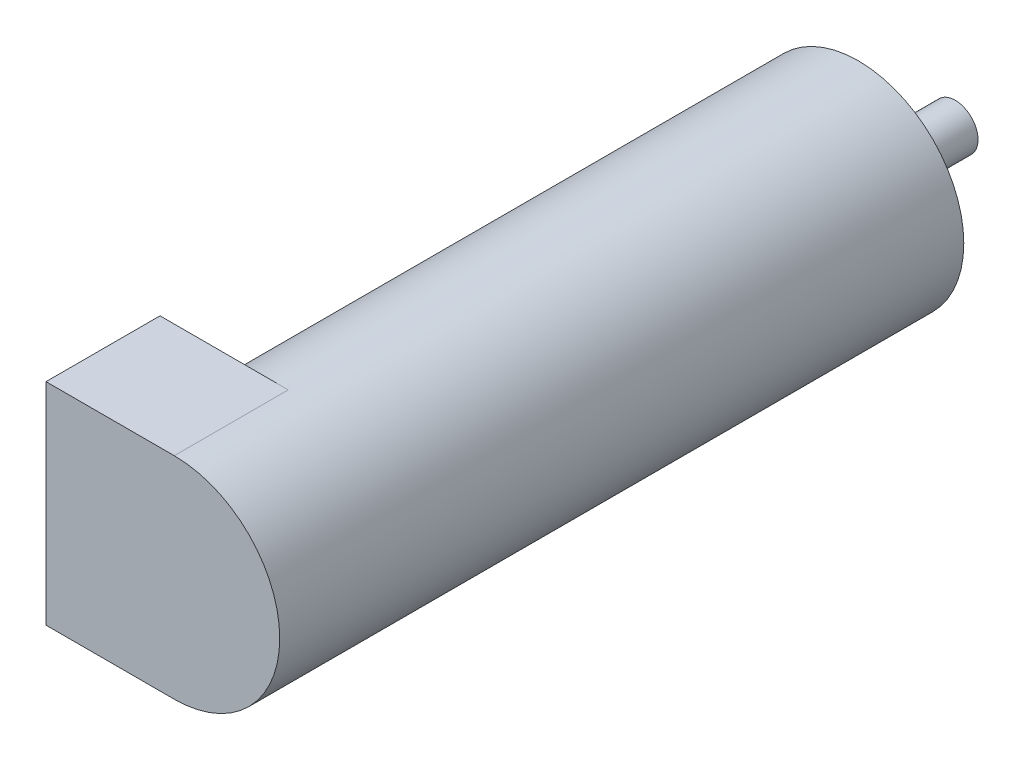
ISO-10303-21;
HEADER;
FILE_DESCRIPTION(('STEP AP214'),'2;1');
FILE_NAME('part.step','',(''),(''),'','','');
FILE_SCHEMA(('AUTOMOTIVE_DESIGN { 1 0 10303 214 1 1 1 1 }'));
ENDSEC;
DATA;
#1=APPLICATION_CONTEXT('core data for automotive mechanical design processes');
#2=APPLICATION_PROTOCOL_DEFINITION('international standard','automotive_design',2000,#1);
#3=PRODUCT_CONTEXT('',#1,'mechanical');
#4=PRODUCT('Part','Part','',(#3));
#5=PRODUCT_RELATED_PRODUCT_CATEGORY('part','',(#4));
#6=PRODUCT_DEFINITION_FORMATION('','',#4);
#7=PRODUCT_DEFINITION_CONTEXT('part definition',#1,'design');
#8=PRODUCT_DEFINITION('design','',#6,#7);
#9=PRODUCT_DEFINITION_SHAPE('','',#8);
#10=(LENGTH_UNIT() NAMED_UNIT(*) SI_UNIT(.MILLI.,.METRE.));
#11=(NAMED_UNIT(*) PLANE_ANGLE_UNIT() SI_UNIT($,.RADIAN.));
#12=(NAMED_UNIT(*) SI_UNIT($,.STERADIAN.) SOLID_ANGLE_UNIT());
#13=UNCERTAINTY_MEASURE_WITH_UNIT(LENGTH_MEASURE(1.E-05),#10,'distance_accuracy_value','');
#14=(GEOMETRIC_REPRESENTATION_CONTEXT(3) GLOBAL_UNCERTAINTY_ASSIGNED_CONTEXT((#13)) GLOBAL_UNIT_ASSIGNED_CONTEXT((#10,
#11,#12)) REPRESENTATION_CONTEXT('',''));
#15=CARTESIAN_POINT('',(0.,0.,0.));
#16=DIRECTION('',(0.,0.,1.));
#17=DIRECTION('',(1.,0.,0.));
#18=AXIS2_PLACEMENT_3D('',#15,#16,#17);
#19=CARTESIAN_POINT('',(0.,0.,100.));
#20=DIRECTION('',(0.,0.,-1.));
#21=DIRECTION('',(-1.,0.,0.));
#22=AXIS2_PLACEMENT_3D('',#19,#20,#21);
#23=CYLINDRICAL_SURFACE('',#22,18.5);
#24=CARTESIAN_POINT('',(0.,0.,100.));
#25=DIRECTION('',(0.,0.,1.));
#26=DIRECTION('',(1.,0.,0.));
#27=AXIS2_PLACEMENT_3D('',#24,#25,#26);
#28=CIRCLE('',#27,18.5);
#29=CARTESIAN_POINT('',(0.,18.5,100.));
#30=VERTEX_POINT('',#29);
#31=CARTESIAN_POINT('',(0.,-18.5,100.));
#32=VERTEX_POINT('',#31);
#33=EDGE_CURVE('E48',#30,#32,#28,.T.);
#34=ORIENTED_EDGE('',*,*,#33,.F.);
#35=DIRECTION('',(0.,0.,-1.));
#36=VECTOR('',#35,1.);
#37=CARTESIAN_POINT('',(0.,18.5,120.));
#38=LINE('',#37,#36);
#39=CARTESIAN_POINT('',(0.,18.5,120.));
#40=VERTEX_POINT('',#39);
#41=EDGE_CURVE('E102',#40,#30,#38,.T.);
#42=ORIENTED_EDGE('',*,*,#41,.F.);
#43=CARTESIAN_POINT('',(0.,0.,120.));
#44=DIRECTION('',(0.,0.,1.));
#45=DIRECTION('',(1.,0.,0.));
#46=AXIS2_PLACEMENT_3D('',#43,#44,#45);
#47=CIRCLE('',#46,18.5);
#48=CARTESIAN_POINT('',(0.,-18.5,120.));
#49=VERTEX_POINT('',#48);
#50=EDGE_CURVE('E94',#49,#40,#47,.T.);
#51=ORIENTED_EDGE('',*,*,#50,.F.);
#52=DIRECTION('',(0.,0.,-1.));
#53=VECTOR('',#52,1.);
#54=CARTESIAN_POINT('',(0.,-18.5,120.));
#55=LINE('',#54,#53);
#56=EDGE_CURVE('E109',#49,#32,#55,.T.);
#57=ORIENTED_EDGE('',*,*,#56,.T.);
#58=EDGE_LOOP('',(#34,#42,#51,#57));
#59=FACE_BOUND('',#58,.T.);
#60=CARTESIAN_POINT('',(0.,0.,0.));
#61=DIRECTION('',(0.,0.,1.));
#62=DIRECTION('',(1.,0.,0.));
#63=AXIS2_PLACEMENT_3D('',#60,#61,#62);
#64=CIRCLE('',#63,18.5);
#65=CARTESIAN_POINT('',(18.5,0.,0.));
#66=VERTEX_POINT('',#65);
#67=EDGE_CURVE('E42',#66,#66,#64,.T.);
#68=ORIENTED_EDGE('',*,*,#67,.T.);
#69=EDGE_LOOP('',(#68));
#70=FACE_BOUND('',#69,.T.);
#71=ADVANCED_FACE('F39',(#59,#70),#23,.T.);
#72=CARTESIAN_POINT('',(0.,0.,0.));
#73=DIRECTION('',(0.,0.,1.));
#74=DIRECTION('',(1.,0.,0.));
#75=AXIS2_PLACEMENT_3D('',#72,#73,#74);
#76=PLANE('',#75);
#77=CARTESIAN_POINT('',(-15.,0.,0.));
#78=DIRECTION('',(0.,0.,-1.));
#79=DIRECTION('',(-1.,0.,0.));
#80=AXIS2_PLACEMENT_3D('',#77,#78,#79);
#81=CIRCLE('',#80,1.5);
#82=CARTESIAN_POINT('',(-16.5,0.,0.));
#83=VERTEX_POINT('',#82);
#84=EDGE_CURVE('E201',#83,#83,#81,.T.);
#85=ORIENTED_EDGE('',*,*,#84,.F.);
#86=EDGE_LOOP('',(#85));
#87=FACE_BOUND('',#86,.T.);
#88=CARTESIAN_POINT('',(0.,15.,0.));
#89=DIRECTION('',(0.,0.,-1.));
#90=DIRECTION('',(-1.,0.,0.));
#91=AXIS2_PLACEMENT_3D('',#88,#89,#90);
#92=CIRCLE('',#91,1.5);
#93=CARTESIAN_POINT('',(-1.5,15.,0.));
#94=VERTEX_POINT('',#93);
#95=EDGE_CURVE('E214',#94,#94,#92,.T.);
#96=ORIENTED_EDGE('',*,*,#95,.F.);
#97=EDGE_LOOP('',(#96));
#98=FACE_BOUND('',#97,.T.);
#99=CARTESIAN_POINT('',(15.,0.,0.));
#100=DIRECTION('',(0.,0.,-1.));
#101=DIRECTION('',(-1.,0.,0.));
#102=AXIS2_PLACEMENT_3D('',#99,#100,#101);
#103=CIRCLE('',#102,1.5);
#104=CARTESIAN_POINT('',(13.5,0.,0.));
#105=VERTEX_POINT('',#104);
#106=EDGE_CURVE('E222',#105,#105,#103,.T.);
#107=ORIENTED_EDGE('',*,*,#106,.F.);
#108=EDGE_LOOP('',(#107));
#109=FACE_BOUND('',#108,.T.);
#110=CARTESIAN_POINT('',(0.,-15.,0.));
#111=DIRECTION('',(0.,0.,-1.));
#112=DIRECTION('',(-1.,0.,0.));
#113=AXIS2_PLACEMENT_3D('',#110,#111,#112);
#114=CIRCLE('',#113,1.5);
#115=CARTESIAN_POINT('',(-1.5,-15.,0.));
#116=VERTEX_POINT('',#115);
#117=EDGE_CURVE('E230',#116,#116,#114,.T.);
#118=ORIENTED_EDGE('',*,*,#117,.F.);
#119=EDGE_LOOP('',(#118));
#120=FACE_BOUND('',#119,.T.);
#121=CARTESIAN_POINT('',(0.,0.,0.));
#122=DIRECTION('',(0.,0.,-1.));
#123=DIRECTION('',(-1.,0.,0.));
#124=AXIS2_PLACEMENT_3D('',#121,#122,#123);
#125=CIRCLE('',#124,4.);
#126=CARTESIAN_POINT('',(-4.,0.,0.));
#127=VERTEX_POINT('',#126);
#128=EDGE_CURVE('E11',#127,#127,#125,.T.);
#129=ORIENTED_EDGE('',*,*,#128,.F.);
#130=EDGE_LOOP('',(#129));
#131=FACE_BOUND('',#130,.T.);
#132=ORIENTED_EDGE('',*,*,#67,.F.);
#133=EDGE_LOOP('',(#132));
#134=FACE_BOUND('',#133,.T.);
#135=ADVANCED_FACE('F133',(#87,#98,#109,#120,#131,#134),#76,.F.);
#136=CARTESIAN_POINT('',(0.,0.,100.));
#137=DIRECTION('',(0.,0.,1.));
#138=DIRECTION('',(1.,0.,0.));
#139=AXIS2_PLACEMENT_3D('',#136,#137,#138);
#140=PLANE('',#139);
#141=DIRECTION('',(-1.,0.,0.));
#142=VECTOR('',#141,1.);
#143=CARTESIAN_POINT('',(0.,18.5,100.));
#144=LINE('',#143,#142);
#145=CARTESIAN_POINT('',(-22.5,18.5,100.));
#146=VERTEX_POINT('',#145);
#147=EDGE_CURVE('E100',#30,#146,#144,.T.);
#148=ORIENTED_EDGE('',*,*,#147,.F.);
#149=ORIENTED_EDGE('',*,*,#33,.T.);
#150=DIRECTION('',(1.,0.,0.));
#151=VECTOR('',#150,1.);
#152=CARTESIAN_POINT('',(-22.5,-18.5,100.));
#153=LINE('',#152,#151);
#154=CARTESIAN_POINT('',(-22.5,-18.5,100.));
#155=VERTEX_POINT('',#154);
#156=EDGE_CURVE('E118',#155,#32,#153,.T.);
#157=ORIENTED_EDGE('',*,*,#156,.F.);
#158=DIRECTION('',(0.,-1.,0.));
#159=VECTOR('',#158,1.);
#160=CARTESIAN_POINT('',(-22.5,18.5,100.));
#161=LINE('',#160,#159);
#162=EDGE_CURVE('E81',#146,#155,#161,.T.);
#163=ORIENTED_EDGE('',*,*,#162,.F.);
#164=EDGE_LOOP('',(#148,#149,#157,#163));
#165=FACE_BOUND('',#164,.T.);
#166=ADVANCED_FACE('F135',(#165),#140,.F.);
#167=CARTESIAN_POINT('',(0.,18.5,120.));
#168=DIRECTION('',(0.,-1.,0.));
#169=DIRECTION('',(1.,0.,0.));
#170=AXIS2_PLACEMENT_3D('',#167,#168,#169);
#171=PLANE('',#170);
#172=ORIENTED_EDGE('',*,*,#147,.T.);
#173=DIRECTION('',(0.,0.,-1.));
#174=VECTOR('',#173,1.);
#175=CARTESIAN_POINT('',(-22.5,18.5,120.));
#176=LINE('',#175,#174);
#177=CARTESIAN_POINT('',(-22.5,18.5,120.));
#178=VERTEX_POINT('',#177);
#179=EDGE_CURVE('E98',#178,#146,#176,.T.);
#180=ORIENTED_EDGE('',*,*,#179,.F.);
#181=DIRECTION('',(-1.,0.,0.));
#182=VECTOR('',#181,1.);
#183=CARTESIAN_POINT('',(0.,18.5,120.));
#184=LINE('',#183,#182);
#185=EDGE_CURVE('E89',#40,#178,#184,.T.);
#186=ORIENTED_EDGE('',*,*,#185,.F.);
#187=ORIENTED_EDGE('',*,*,#41,.T.);
#188=EDGE_LOOP('',(#172,#180,#186,#187));
#189=FACE_BOUND('',#188,.T.);
#190=ADVANCED_FACE('F99',(#189),#171,.F.);
#191=CARTESIAN_POINT('',(-22.5,18.5,120.));
#192=DIRECTION('',(1.,0.,0.));
#193=DIRECTION('',(0.,1.,0.));
#194=AXIS2_PLACEMENT_3D('',#191,#192,#193);
#195=PLANE('',#194);
#196=ORIENTED_EDGE('',*,*,#162,.T.);
#197=DIRECTION('',(0.,0.,-1.));
#198=VECTOR('',#197,1.);
#199=CARTESIAN_POINT('',(-22.5,-18.5,120.));
#200=LINE('',#199,#198);
#201=CARTESIAN_POINT('',(-22.5,-18.5,120.));
#202=VERTEX_POINT('',#201);
#203=EDGE_CURVE('E103',#202,#155,#200,.T.);
#204=ORIENTED_EDGE('',*,*,#203,.F.);
#205=DIRECTION('',(0.,-1.,0.));
#206=VECTOR('',#205,1.);
#207=CARTESIAN_POINT('',(-22.5,18.5,120.));
#208=LINE('',#207,#206);
#209=EDGE_CURVE('E92',#178,#202,#208,.T.);
#210=ORIENTED_EDGE('',*,*,#209,.F.);
#211=ORIENTED_EDGE('',*,*,#179,.T.);
#212=EDGE_LOOP('',(#196,#204,#210,#211));
#213=FACE_BOUND('',#212,.T.);
#214=ADVANCED_FACE('F105',(#213),#195,.F.);
#215=CARTESIAN_POINT('',(-22.5,-18.5,120.));
#216=DIRECTION('',(0.,1.,0.));
#217=DIRECTION('',(0.,0.,1.));
#218=AXIS2_PLACEMENT_3D('',#215,#216,#217);
#219=PLANE('',#218);
#220=ORIENTED_EDGE('',*,*,#156,.T.);
#221=ORIENTED_EDGE('',*,*,#56,.F.);
#222=DIRECTION('',(1.,0.,0.));
#223=VECTOR('',#222,1.);
#224=CARTESIAN_POINT('',(-22.5,-18.5,120.));
#225=LINE('',#224,#223);
#226=EDGE_CURVE('E64',#202,#49,#225,.T.);
#227=ORIENTED_EDGE('',*,*,#226,.F.);
#228=ORIENTED_EDGE('',*,*,#203,.T.);
#229=EDGE_LOOP('',(#220,#221,#227,#228));
#230=FACE_BOUND('',#229,.T.);
#231=ADVANCED_FACE('F150',(#230),#219,.F.);
#232=CARTESIAN_POINT('',(0.,0.,120.));
#233=DIRECTION('',(0.,0.,1.));
#234=DIRECTION('',(1.,0.,0.));
#235=AXIS2_PLACEMENT_3D('',#232,#233,#234);
#236=PLANE('',#235);
#237=ORIENTED_EDGE('',*,*,#50,.T.);
#238=ORIENTED_EDGE('',*,*,#185,.T.);
#239=ORIENTED_EDGE('',*,*,#209,.T.);
#240=ORIENTED_EDGE('',*,*,#226,.T.);
#241=EDGE_LOOP('',(#237,#238,#239,#240));
#242=FACE_BOUND('',#241,.T.);
#243=ADVANCED_FACE('F90',(#242),#236,.T.);
#244=CARTESIAN_POINT('',(0.,0.,-17.));
#245=DIRECTION('',(0.,0.,1.));
#246=DIRECTION('',(1.,0.,0.));
#247=AXIS2_PLACEMENT_3D('',#244,#245,#246);
#248=CYLINDRICAL_SURFACE('',#247,4.);
#249=CARTESIAN_POINT('',(0.,0.,-17.));
#250=DIRECTION('',(0.,0.,-1.));
#251=DIRECTION('',(-1.,0.,0.));
#252=AXIS2_PLACEMENT_3D('',#249,#250,#251);
#253=CIRCLE('',#252,4.);
#254=CARTESIAN_POINT('',(-4.,0.,-17.));
#255=VERTEX_POINT('',#254);
#256=EDGE_CURVE('E115',#255,#255,#253,.T.);
#257=ORIENTED_EDGE('',*,*,#256,.F.);
#258=EDGE_LOOP('',(#257));
#259=FACE_BOUND('',#258,.T.);
#260=ORIENTED_EDGE('',*,*,#128,.T.);
#261=EDGE_LOOP('',(#260));
#262=FACE_BOUND('',#261,.T.);
#263=ADVANCED_FACE('F156',(#259,#262),#248,.T.);
#264=CARTESIAN_POINT('',(0.,0.,-17.));
#265=DIRECTION('',(0.,0.,-1.));
#266=DIRECTION('',(-1.,0.,0.));
#267=AXIS2_PLACEMENT_3D('',#264,#265,#266);
#268=PLANE('',#267);
#269=ORIENTED_EDGE('',*,*,#256,.T.);
#270=EDGE_LOOP('',(#269));
#271=FACE_BOUND('',#270,.T.);
#272=ADVANCED_FACE('F159',(#271),#268,.T.);
#273=CARTESIAN_POINT('',(0.,-15.,3.));
#274=DIRECTION('',(0.,0.,-1.));
#275=DIRECTION('',(-1.,0.,0.));
#276=AXIS2_PLACEMENT_3D('',#273,#274,#275);
#277=CYLINDRICAL_SURFACE('',#276,1.5);
#278=CARTESIAN_POINT('',(0.,-15.,3.));
#279=DIRECTION('',(0.,0.,-1.));
#280=DIRECTION('',(-1.,0.,0.));
#281=AXIS2_PLACEMENT_3D('',#278,#279,#280);
#282=CIRCLE('',#281,1.5);
#283=CARTESIAN_POINT('',(-1.5,-15.,3.));
#284=VERTEX_POINT('',#283);
#285=EDGE_CURVE('E226',#284,#284,#282,.T.);
#286=ORIENTED_EDGE('',*,*,#285,.F.);
#287=EDGE_LOOP('',(#286));
#288=FACE_BOUND('',#287,.T.);
#289=ORIENTED_EDGE('',*,*,#117,.T.);
#290=EDGE_LOOP('',(#289));
#291=FACE_BOUND('',#290,.T.);
#292=ADVANCED_FACE('F163',(#288,#291),#277,.F.);
#293=CARTESIAN_POINT('',(0.,-15.,3.));
#294=DIRECTION('',(0.,0.,-1.));
#295=DIRECTION('',(-1.,0.,0.));
#296=AXIS2_PLACEMENT_3D('',#293,#294,#295);
#297=PLANE('',#296);
#298=ORIENTED_EDGE('',*,*,#285,.T.);
#299=EDGE_LOOP('',(#298));
#300=FACE_BOUND('',#299,.T.);
#301=ADVANCED_FACE('F167',(#300),#297,.T.);
#302=CARTESIAN_POINT('',(15.,0.,3.));
#303=DIRECTION('',(0.,0.,-1.));
#304=DIRECTION('',(-1.,0.,0.));
#305=AXIS2_PLACEMENT_3D('',#302,#303,#304);
#306=CYLINDRICAL_SURFACE('',#305,1.5);
#307=CARTESIAN_POINT('',(15.,0.,3.));
#308=DIRECTION('',(0.,0.,-1.));
#309=DIRECTION('',(-1.,0.,0.));
#310=AXIS2_PLACEMENT_3D('',#307,#308,#309);
#311=CIRCLE('',#310,1.5);
#312=CARTESIAN_POINT('',(13.5,0.,3.));
#313=VERTEX_POINT('',#312);
#314=EDGE_CURVE('E218',#313,#313,#311,.T.);
#315=ORIENTED_EDGE('',*,*,#314,.F.);
#316=EDGE_LOOP('',(#315));
#317=FACE_BOUND('',#316,.T.);
#318=ORIENTED_EDGE('',*,*,#106,.T.);
#319=EDGE_LOOP('',(#318));
#320=FACE_BOUND('',#319,.T.);
#321=ADVANCED_FACE('F171',(#317,#320),#306,.F.);
#322=CARTESIAN_POINT('',(15.,0.,3.));
#323=DIRECTION('',(0.,0.,-1.));
#324=DIRECTION('',(-1.,0.,0.));
#325=AXIS2_PLACEMENT_3D('',#322,#323,#324);
#326=PLANE('',#325);
#327=ORIENTED_EDGE('',*,*,#314,.T.);
#328=EDGE_LOOP('',(#327));
#329=FACE_BOUND('',#328,.T.);
#330=ADVANCED_FACE('F175',(#329),#326,.T.);
#331=CARTESIAN_POINT('',(0.,15.,3.));
#332=DIRECTION('',(0.,0.,-1.));
#333=DIRECTION('',(-1.,0.,0.));
#334=AXIS2_PLACEMENT_3D('',#331,#332,#333);
#335=CYLINDRICAL_SURFACE('',#334,1.5);
#336=CARTESIAN_POINT('',(0.,15.,3.));
#337=DIRECTION('',(0.,0.,-1.));
#338=DIRECTION('',(-1.,0.,0.));
#339=AXIS2_PLACEMENT_3D('',#336,#337,#338);
#340=CIRCLE('',#339,1.5);
#341=CARTESIAN_POINT('',(-1.5,15.,3.));
#342=VERTEX_POINT('',#341);
#343=EDGE_CURVE('E208',#342,#342,#340,.T.);
#344=ORIENTED_EDGE('',*,*,#343,.F.);
#345=EDGE_LOOP('',(#344));
#346=FACE_BOUND('',#345,.T.);
#347=ORIENTED_EDGE('',*,*,#95,.T.);
#348=EDGE_LOOP('',(#347));
#349=FACE_BOUND('',#348,.T.);
#350=ADVANCED_FACE('F179',(#346,#349),#335,.F.);
#351=CARTESIAN_POINT('',(0.,15.,3.));
#352=DIRECTION('',(0.,0.,-1.));
#353=DIRECTION('',(-1.,0.,0.));
#354=AXIS2_PLACEMENT_3D('',#351,#352,#353);
#355=PLANE('',#354);
#356=ORIENTED_EDGE('',*,*,#343,.T.);
#357=EDGE_LOOP('',(#356));
#358=FACE_BOUND('',#357,.T.);
#359=ADVANCED_FACE('F183',(#358),#355,.T.);
#360=CARTESIAN_POINT('',(-15.,0.,3.));
#361=DIRECTION('',(0.,0.,-1.));
#362=DIRECTION('',(-1.,0.,0.));
#363=AXIS2_PLACEMENT_3D('',#360,#361,#362);
#364=CYLINDRICAL_SURFACE('',#363,1.5);
#365=CARTESIAN_POINT('',(-15.,0.,3.));
#366=DIRECTION('',(0.,0.,-1.));
#367=DIRECTION('',(-1.,0.,0.));
#368=AXIS2_PLACEMENT_3D('',#365,#366,#367);
#369=CIRCLE('',#368,1.5);
#370=CARTESIAN_POINT('',(-16.5,0.,3.));
#371=VERTEX_POINT('',#370);
#372=EDGE_CURVE('E199',#371,#371,#369,.T.);
#373=ORIENTED_EDGE('',*,*,#372,.F.);
#374=EDGE_LOOP('',(#373));
#375=FACE_BOUND('',#374,.T.);
#376=ORIENTED_EDGE('',*,*,#84,.T.);
#377=EDGE_LOOP('',(#376));
#378=FACE_BOUND('',#377,.T.);
#379=ADVANCED_FACE('F187',(#375,#378),#364,.F.);
#380=CARTESIAN_POINT('',(-15.,0.,3.));
#381=DIRECTION('',(0.,0.,-1.));
#382=DIRECTION('',(-1.,0.,0.));
#383=AXIS2_PLACEMENT_3D('',#380,#381,#382);
#384=PLANE('',#383);
#385=ORIENTED_EDGE('',*,*,#372,.T.);
#386=EDGE_LOOP('',(#385));
#387=FACE_BOUND('',#386,.T.);
#388=ADVANCED_FACE('F191',(#387),#384,.T.);
#389=CLOSED_SHELL('',(#71,#135,#166,#190,#214,#231,#243,#263,#272,#292,#301,#321,#330,#350,#359,
#379,#388));
#390=MANIFOLD_SOLID_BREP('B2',#389);
#391=ADVANCED_BREP_SHAPE_REPRESENTATION('',(#18,#390),#14);
#392=SHAPE_DEFINITION_REPRESENTATION(#9,#391);
ENDSEC;
END-ISO-10303-21;
